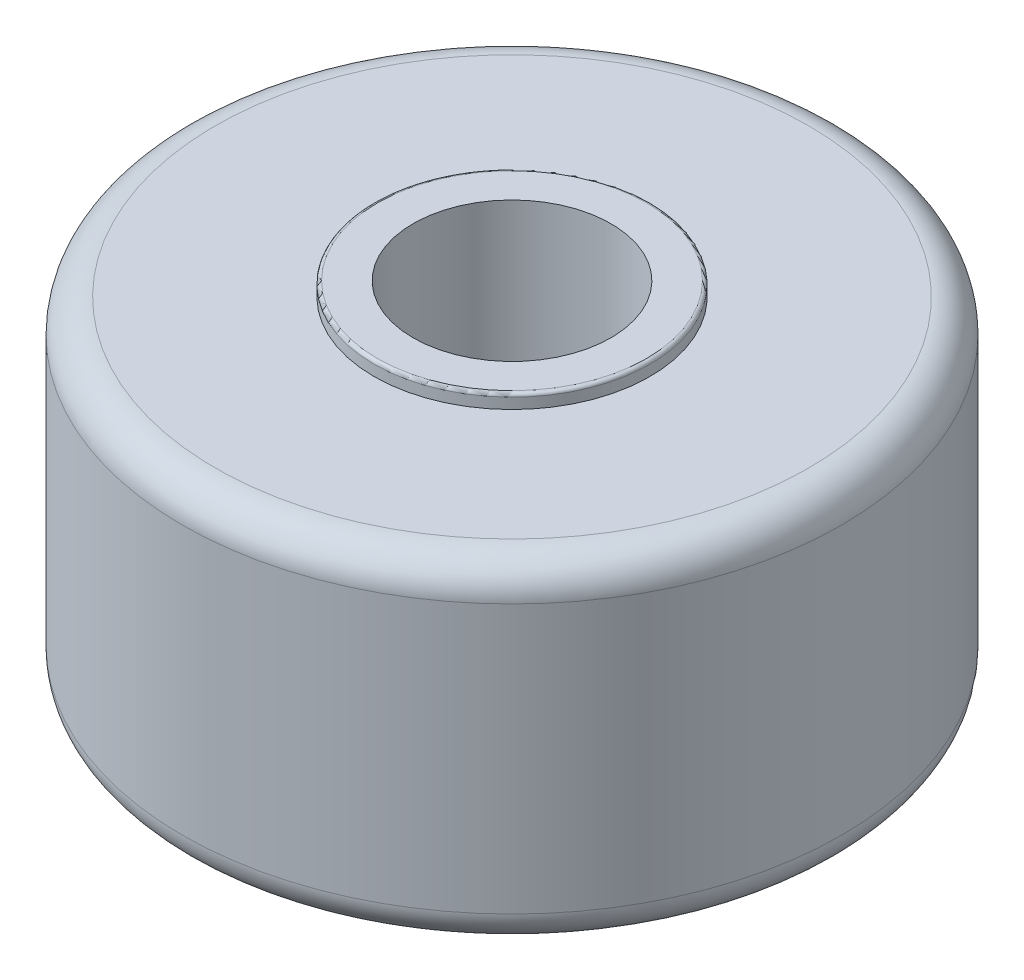
ISO-10303-21;
HEADER;
FILE_DESCRIPTION(('STEP AP214'),'2;1');
FILE_NAME('part.step','',(''),(''),'','','');
FILE_SCHEMA(('AUTOMOTIVE_DESIGN { 1 0 10303 214 1 1 1 1 }'));
ENDSEC;
DATA;
#1=APPLICATION_CONTEXT('core data for automotive mechanical design processes');
#2=APPLICATION_PROTOCOL_DEFINITION('international standard','automotive_design',2000,#1);
#3=PRODUCT_CONTEXT('',#1,'mechanical');
#4=PRODUCT('Part','Part','',(#3));
#5=PRODUCT_RELATED_PRODUCT_CATEGORY('part','',(#4));
#6=PRODUCT_DEFINITION_FORMATION('','',#4);
#7=PRODUCT_DEFINITION_CONTEXT('part definition',#1,'design');
#8=PRODUCT_DEFINITION('design','',#6,#7);
#9=PRODUCT_DEFINITION_SHAPE('','',#8);
#10=(LENGTH_UNIT() NAMED_UNIT(*) SI_UNIT(.MILLI.,.METRE.));
#11=(NAMED_UNIT(*) PLANE_ANGLE_UNIT() SI_UNIT($,.RADIAN.));
#12=(NAMED_UNIT(*) SI_UNIT($,.STERADIAN.) SOLID_ANGLE_UNIT());
#13=UNCERTAINTY_MEASURE_WITH_UNIT(LENGTH_MEASURE(1.E-05),#10,'distance_accuracy_value','');
#14=(GEOMETRIC_REPRESENTATION_CONTEXT(3) GLOBAL_UNCERTAINTY_ASSIGNED_CONTEXT((#13)) GLOBAL_UNIT_ASSIGNED_CONTEXT((#10,
#11,#12)) REPRESENTATION_CONTEXT('',''));
#15=CARTESIAN_POINT('',(0.,0.,0.));
#16=DIRECTION('',(0.,0.,1.));
#17=DIRECTION('',(1.,0.,0.));
#18=AXIS2_PLACEMENT_3D('',#15,#16,#17);
#19=CARTESIAN_POINT('',(0.,25.781,0.));
#20=DIRECTION('',(0.,1.,0.));
#21=DIRECTION('',(0.,0.,1.));
#22=AXIS2_PLACEMENT_3D('',#19,#20,#21);
#23=CYLINDRICAL_SURFACE('',#22,50.8);
#24=CARTESIAN_POINT('',(0.,20.701,0.));
#25=DIRECTION('',(0.,-1.,0.));
#26=DIRECTION('',(0.,0.,-1.));
#27=AXIS2_PLACEMENT_3D('',#24,#25,#26);
#28=CIRCLE('',#27,50.8);
#29=CARTESIAN_POINT('',(0.,20.701,-50.8));
#30=VERTEX_POINT('',#29);
#31=EDGE_CURVE('E56',#30,#30,#28,.T.);
#32=ORIENTED_EDGE('',*,*,#31,.T.);
#33=EDGE_LOOP('',(#32));
#34=FACE_BOUND('',#33,.T.);
#35=CARTESIAN_POINT('',(0.,-20.701,0.));
#36=DIRECTION('',(0.,1.,0.));
#37=DIRECTION('',(0.,0.,1.));
#38=AXIS2_PLACEMENT_3D('',#35,#36,#37);
#39=CIRCLE('',#38,50.8);
#40=CARTESIAN_POINT('',(0.,-20.701,50.8));
#41=VERTEX_POINT('',#40);
#42=EDGE_CURVE('E59',#41,#41,#39,.T.);
#43=ORIENTED_EDGE('',*,*,#42,.T.);
#44=EDGE_LOOP('',(#43));
#45=FACE_BOUND('',#44,.T.);
#46=ADVANCED_FACE('F33',(#34,#45),#23,.T.);
#47=CARTESIAN_POINT('',(0.,25.781,-21.2725));
#48=DIRECTION('',(0.,-1.,0.));
#49=DIRECTION('',(0.,0.,-1.));
#50=AXIS2_PLACEMENT_3D('',#47,#48,#49);
#51=PLANE('',#50);
#52=CARTESIAN_POINT('',(0.,25.781,0.));
#53=DIRECTION('',(0.,-1.,0.));
#54=DIRECTION('',(0.,0.,-1.));
#55=AXIS2_PLACEMENT_3D('',#52,#53,#54);
#56=CIRCLE('',#55,45.72);
#57=CARTESIAN_POINT('',(0.,25.781,-45.72));
#58=VERTEX_POINT('',#57);
#59=EDGE_CURVE('E62',#58,#58,#56,.F.);
#60=ORIENTED_EDGE('',*,*,#59,.T.);
#61=EDGE_LOOP('',(#60));
#62=FACE_BOUND('',#61,.T.);
#63=CARTESIAN_POINT('',(0.,25.781,0.));
#64=DIRECTION('',(0.,1.,0.));
#65=DIRECTION('',(0.,0.,1.));
#66=AXIS2_PLACEMENT_3D('',#63,#64,#65);
#67=CIRCLE('',#66,21.2725);
#68=CARTESIAN_POINT('',(0.,25.781,21.2725));
#69=VERTEX_POINT('',#68);
#70=EDGE_CURVE('E65',#69,#69,#67,.T.);
#71=ORIENTED_EDGE('',*,*,#70,.F.);
#72=EDGE_LOOP('',(#71));
#73=FACE_BOUND('',#72,.T.);
#74=ADVANCED_FACE('F96',(#62,#73),#51,.F.);
#75=CARTESIAN_POINT('',(0.,25.781,0.));
#76=DIRECTION('',(0.,1.,0.));
#77=DIRECTION('',(0.,0.,1.));
#78=AXIS2_PLACEMENT_3D('',#75,#76,#77);
#79=CYLINDRICAL_SURFACE('',#78,21.2725);
#80=CARTESIAN_POINT('',(0.,27.432,0.));
#81=DIRECTION('',(0.,-1.,0.));
#82=DIRECTION('',(0.,0.,-1.));
#83=AXIS2_PLACEMENT_3D('',#80,#81,#82);
#84=CIRCLE('',#83,21.2725);
#85=CARTESIAN_POINT('',(0.,27.432,-21.2725));
#86=VERTEX_POINT('',#85);
#87=EDGE_CURVE('E10',#86,#86,#84,.T.);
#88=ORIENTED_EDGE('',*,*,#87,.T.);
#89=EDGE_LOOP('',(#88));
#90=FACE_BOUND('',#89,.T.);
#91=ORIENTED_EDGE('',*,*,#70,.T.);
#92=EDGE_LOOP('',(#91));
#93=FACE_BOUND('',#92,.T.);
#94=ADVANCED_FACE('F102',(#90,#93),#79,.T.);
#95=CARTESIAN_POINT('',(0.,27.94,-21.2725));
#96=DIRECTION('',(0.,-1.,0.));
#97=DIRECTION('',(0.,0.,-1.));
#98=AXIS2_PLACEMENT_3D('',#95,#96,#97);
#99=PLANE('',#98);
#100=CARTESIAN_POINT('',(0.,27.94,0.));
#101=DIRECTION('',(0.,-1.,0.));
#102=DIRECTION('',(0.,0.,-1.));
#103=AXIS2_PLACEMENT_3D('',#100,#101,#102);
#104=CIRCLE('',#103,20.7645);
#105=CARTESIAN_POINT('',(0.,27.94,-20.7645));
#106=VERTEX_POINT('',#105);
#107=EDGE_CURVE('E40',#106,#106,#104,.F.);
#108=ORIENTED_EDGE('',*,*,#107,.T.);
#109=EDGE_LOOP('',(#108));
#110=FACE_BOUND('',#109,.T.);
#111=CARTESIAN_POINT('',(0.,27.94,0.));
#112=DIRECTION('',(0.,1.,0.));
#113=DIRECTION('',(0.,0.,1.));
#114=AXIS2_PLACEMENT_3D('',#111,#112,#113);
#115=CIRCLE('',#114,15.2527);
#116=CARTESIAN_POINT('',(0.,27.94,15.2527));
#117=VERTEX_POINT('',#116);
#118=EDGE_CURVE('E68',#117,#117,#115,.T.);
#119=ORIENTED_EDGE('',*,*,#118,.F.);
#120=EDGE_LOOP('',(#119));
#121=FACE_BOUND('',#120,.T.);
#122=ADVANCED_FACE('F129',(#110,#121),#99,.F.);
#123=CARTESIAN_POINT('',(0.,25.781,0.));
#124=DIRECTION('',(0.,1.,0.));
#125=DIRECTION('',(0.,0.,1.));
#126=AXIS2_PLACEMENT_3D('',#123,#124,#125);
#127=CYLINDRICAL_SURFACE('',#126,15.2527);
#128=CARTESIAN_POINT('',(0.,-27.94,0.));
#129=DIRECTION('',(0.,1.,0.));
#130=DIRECTION('',(0.,0.,1.));
#131=AXIS2_PLACEMENT_3D('',#128,#129,#130);
#132=CIRCLE('',#131,15.2527);
#133=CARTESIAN_POINT('',(0.,-27.94,15.2527));
#134=VERTEX_POINT('',#133);
#135=EDGE_CURVE('E71',#134,#134,#132,.T.);
#136=ORIENTED_EDGE('',*,*,#135,.F.);
#137=EDGE_LOOP('',(#136));
#138=FACE_BOUND('',#137,.T.);
#139=ORIENTED_EDGE('',*,*,#118,.T.);
#140=EDGE_LOOP('',(#139));
#141=FACE_BOUND('',#140,.T.);
#142=ADVANCED_FACE('F92',(#138,#141),#127,.F.);
#143=CARTESIAN_POINT('',(0.,-27.94,-21.2725));
#144=DIRECTION('',(0.,1.,0.));
#145=DIRECTION('',(0.,0.,1.));
#146=AXIS2_PLACEMENT_3D('',#143,#144,#145);
#147=PLANE('',#146);
#148=CARTESIAN_POINT('',(0.,-27.94,0.));
#149=DIRECTION('',(0.,1.,0.));
#150=DIRECTION('',(0.,0.,1.));
#151=AXIS2_PLACEMENT_3D('',#148,#149,#150);
#152=CIRCLE('',#151,20.7645);
#153=CARTESIAN_POINT('',(0.,-27.94,20.7645));
#154=VERTEX_POINT('',#153);
#155=EDGE_CURVE('E44',#154,#154,#152,.F.);
#156=ORIENTED_EDGE('',*,*,#155,.T.);
#157=EDGE_LOOP('',(#156));
#158=FACE_BOUND('',#157,.T.);
#159=ORIENTED_EDGE('',*,*,#135,.T.);
#160=EDGE_LOOP('',(#159));
#161=FACE_BOUND('',#160,.T.);
#162=ADVANCED_FACE('F82',(#158,#161),#147,.F.);
#163=CARTESIAN_POINT('',(0.,25.781,0.));
#164=DIRECTION('',(0.,1.,0.));
#165=DIRECTION('',(0.,0.,1.));
#166=AXIS2_PLACEMENT_3D('',#163,#164,#165);
#167=CYLINDRICAL_SURFACE('',#166,21.2725);
#168=CARTESIAN_POINT('',(0.,-27.432,0.));
#169=DIRECTION('',(0.,1.,0.));
#170=DIRECTION('',(0.,0.,1.));
#171=AXIS2_PLACEMENT_3D('',#168,#169,#170);
#172=CIRCLE('',#171,21.2725);
#173=CARTESIAN_POINT('',(0.,-27.432,21.2725));
#174=VERTEX_POINT('',#173);
#175=EDGE_CURVE('E48',#174,#174,#172,.T.);
#176=ORIENTED_EDGE('',*,*,#175,.T.);
#177=EDGE_LOOP('',(#176));
#178=FACE_BOUND('',#177,.T.);
#179=CARTESIAN_POINT('',(0.,-25.781,0.));
#180=DIRECTION('',(0.,1.,0.));
#181=DIRECTION('',(0.,0.,1.));
#182=AXIS2_PLACEMENT_3D('',#179,#180,#181);
#183=CIRCLE('',#182,21.2725);
#184=CARTESIAN_POINT('',(0.,-25.781,21.2725));
#185=VERTEX_POINT('',#184);
#186=EDGE_CURVE('E74',#185,#185,#183,.T.);
#187=ORIENTED_EDGE('',*,*,#186,.F.);
#188=EDGE_LOOP('',(#187));
#189=FACE_BOUND('',#188,.T.);
#190=ADVANCED_FACE('F80',(#178,#189),#167,.T.);
#191=CARTESIAN_POINT('',(0.,-25.781,-21.2725));
#192=DIRECTION('',(0.,1.,0.));
#193=DIRECTION('',(0.,0.,1.));
#194=AXIS2_PLACEMENT_3D('',#191,#192,#193);
#195=PLANE('',#194);
#196=CARTESIAN_POINT('',(0.,-25.781,0.));
#197=DIRECTION('',(0.,1.,0.));
#198=DIRECTION('',(0.,0.,1.));
#199=AXIS2_PLACEMENT_3D('',#196,#197,#198);
#200=CIRCLE('',#199,45.72);
#201=CARTESIAN_POINT('',(0.,-25.781,45.72));
#202=VERTEX_POINT('',#201);
#203=EDGE_CURVE('E53',#202,#202,#200,.F.);
#204=ORIENTED_EDGE('',*,*,#203,.T.);
#205=EDGE_LOOP('',(#204));
#206=FACE_BOUND('',#205,.T.);
#207=ORIENTED_EDGE('',*,*,#186,.T.);
#208=EDGE_LOOP('',(#207));
#209=FACE_BOUND('',#208,.T.);
#210=ADVANCED_FACE('F78',(#206,#209),#195,.F.);
#211=CARTESIAN_POINT('',(0.,20.701,0.));
#212=DIRECTION('',(0.,-1.,0.));
#213=DIRECTION('',(0.,0.,-1.));
#214=AXIS2_PLACEMENT_3D('',#211,#212,#213);
#215=TOROIDAL_SURFACE('',#214,45.72,5.08);
#216=ORIENTED_EDGE('',*,*,#31,.F.);
#217=EDGE_LOOP('',(#216));
#218=FACE_BOUND('',#217,.T.);
#219=ORIENTED_EDGE('',*,*,#59,.F.);
#220=EDGE_LOOP('',(#219));
#221=FACE_BOUND('',#220,.T.);
#222=ADVANCED_FACE('F89',(#218,#221),#215,.T.);
#223=CARTESIAN_POINT('',(0.,-20.701,0.));
#224=DIRECTION('',(0.,1.,0.));
#225=DIRECTION('',(0.,0.,1.));
#226=AXIS2_PLACEMENT_3D('',#223,#224,#225);
#227=TOROIDAL_SURFACE('',#226,45.72,5.08);
#228=ORIENTED_EDGE('',*,*,#203,.F.);
#229=EDGE_LOOP('',(#228));
#230=FACE_BOUND('',#229,.T.);
#231=ORIENTED_EDGE('',*,*,#42,.F.);
#232=EDGE_LOOP('',(#231));
#233=FACE_BOUND('',#232,.T.);
#234=ADVANCED_FACE('F110',(#230,#233),#227,.T.);
#235=CARTESIAN_POINT('',(0.,-27.432,0.));
#236=DIRECTION('',(0.,1.,0.));
#237=DIRECTION('',(0.,0.,1.));
#238=AXIS2_PLACEMENT_3D('',#235,#236,#237);
#239=TOROIDAL_SURFACE('',#238,20.7645,0.508);
#240=ORIENTED_EDGE('',*,*,#155,.F.);
#241=EDGE_LOOP('',(#240));
#242=FACE_BOUND('',#241,.T.);
#243=ORIENTED_EDGE('',*,*,#175,.F.);
#244=EDGE_LOOP('',(#243));
#245=FACE_BOUND('',#244,.T.);
#246=ADVANCED_FACE('F113',(#242,#245),#239,.T.);
#247=CARTESIAN_POINT('',(0.,27.432,0.));
#248=DIRECTION('',(0.,-1.,0.));
#249=DIRECTION('',(0.,0.,-1.));
#250=AXIS2_PLACEMENT_3D('',#247,#248,#249);
#251=TOROIDAL_SURFACE('',#250,20.7645,0.508);
#252=ORIENTED_EDGE('',*,*,#87,.F.);
#253=EDGE_LOOP('',(#252));
#254=FACE_BOUND('',#253,.T.);
#255=ORIENTED_EDGE('',*,*,#107,.F.);
#256=EDGE_LOOP('',(#255));
#257=FACE_BOUND('',#256,.T.);
#258=ADVANCED_FACE('F35',(#254,#257),#251,.T.);
#259=CLOSED_SHELL('',(#46,#74,#94,#122,#142,#162,#190,#210,#222,#234,#246,#258));
#260=MANIFOLD_SOLID_BREP('B2',#259);
#261=ADVANCED_BREP_SHAPE_REPRESENTATION('',(#18,#260),#14);
#262=SHAPE_DEFINITION_REPRESENTATION(#9,#261);
ENDSEC;
END-ISO-10303-21;
